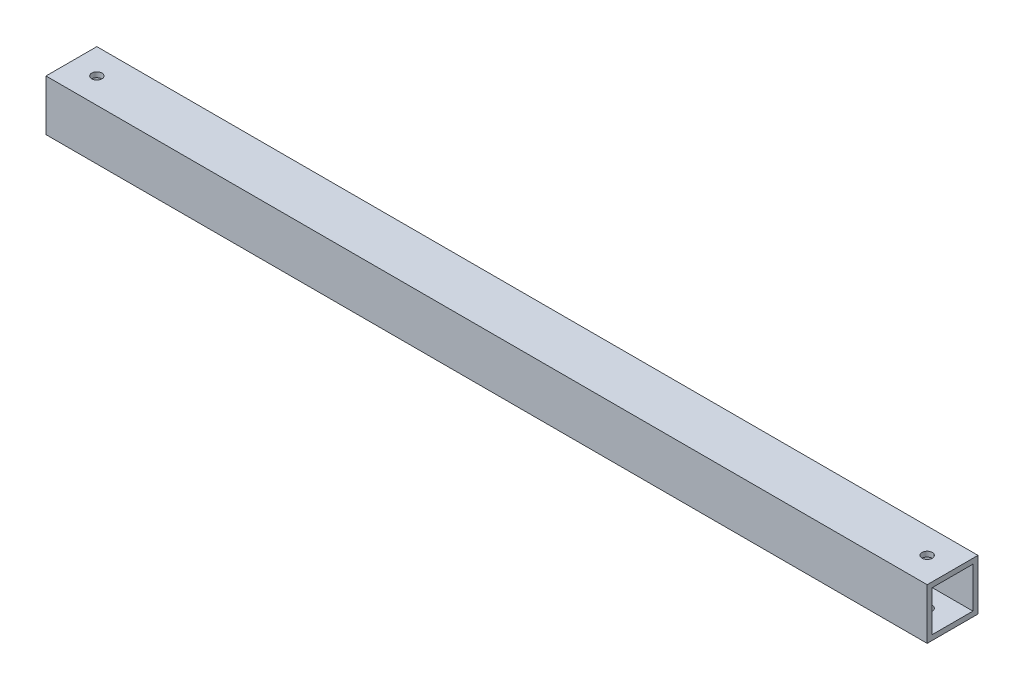
ISO-10303-21;
HEADER;
FILE_DESCRIPTION(('STEP AP214'),'2;1');
FILE_NAME('part.step','',(''),(''),'','','');
FILE_SCHEMA(('AUTOMOTIVE_DESIGN { 1 0 10303 214 1 1 1 1 }'));
ENDSEC;
DATA;
#1=APPLICATION_CONTEXT('core data for automotive mechanical design processes');
#2=APPLICATION_PROTOCOL_DEFINITION('international standard','automotive_design',2000,#1);
#3=PRODUCT_CONTEXT('',#1,'mechanical');
#4=PRODUCT('Part','Part','',(#3));
#5=PRODUCT_RELATED_PRODUCT_CATEGORY('part','',(#4));
#6=PRODUCT_DEFINITION_FORMATION('','',#4);
#7=PRODUCT_DEFINITION_CONTEXT('part definition',#1,'design');
#8=PRODUCT_DEFINITION('design','',#6,#7);
#9=PRODUCT_DEFINITION_SHAPE('','',#8);
#10=(LENGTH_UNIT() NAMED_UNIT(*) SI_UNIT(.MILLI.,.METRE.));
#11=(NAMED_UNIT(*) PLANE_ANGLE_UNIT() SI_UNIT($,.RADIAN.));
#12=(NAMED_UNIT(*) SI_UNIT($,.STERADIAN.) SOLID_ANGLE_UNIT());
#13=UNCERTAINTY_MEASURE_WITH_UNIT(LENGTH_MEASURE(1.E-05),#10,'distance_accuracy_value','');
#14=(GEOMETRIC_REPRESENTATION_CONTEXT(3) GLOBAL_UNCERTAINTY_ASSIGNED_CONTEXT((#13)) GLOBAL_UNIT_ASSIGNED_CONTEXT((#10,
#11,#12)) REPRESENTATION_CONTEXT('',''));
#15=CARTESIAN_POINT('',(0.,0.,0.));
#16=DIRECTION('',(0.,0.,1.));
#17=DIRECTION('',(1.,0.,0.));
#18=AXIS2_PLACEMENT_3D('',#15,#16,#17);
#19=CARTESIAN_POINT('',(252.5,0.,7.5));
#20=DIRECTION('',(0.,1.,0.));
#21=DIRECTION('',(0.,0.,1.));
#22=AXIS2_PLACEMENT_3D('',#19,#20,#21);
#23=CYLINDRICAL_SURFACE('',#22,1.50000000000002);
#24=CARTESIAN_POINT('',(252.5,1.5,7.5));
#25=DIRECTION('',(0.,-1.,0.));
#26=DIRECTION('',(0.,0.,-1.));
#27=AXIS2_PLACEMENT_3D('',#24,#25,#26);
#28=CIRCLE('',#27,1.50000000000002);
#29=CARTESIAN_POINT('',(252.5,1.5,5.99999999999998));
#30=VERTEX_POINT('',#29);
#31=EDGE_CURVE('E166',#30,#30,#28,.F.);
#32=ORIENTED_EDGE('',*,*,#31,.T.);
#33=EDGE_LOOP('',(#32));
#34=FACE_BOUND('',#33,.T.);
#35=CARTESIAN_POINT('',(252.5,0.,7.5));
#36=DIRECTION('',(0.,1.,0.));
#37=DIRECTION('',(0.,0.,1.));
#38=AXIS2_PLACEMENT_3D('',#35,#36,#37);
#39=CIRCLE('',#38,1.50000000000002);
#40=CARTESIAN_POINT('',(252.5,0.,9.00000000000002));
#41=VERTEX_POINT('',#40);
#42=EDGE_CURVE('E170',#41,#41,#39,.T.);
#43=ORIENTED_EDGE('',*,*,#42,.F.);
#44=EDGE_LOOP('',(#43));
#45=FACE_BOUND('',#44,.T.);
#46=ADVANCED_FACE('F45',(#34,#45),#23,.F.);
#47=CARTESIAN_POINT('',(7.5,0.,7.50000000000003));
#48=DIRECTION('',(0.,1.,0.));
#49=DIRECTION('',(0.,0.,1.));
#50=AXIS2_PLACEMENT_3D('',#47,#48,#49);
#51=CYLINDRICAL_SURFACE('',#50,1.5);
#52=CARTESIAN_POINT('',(7.5,1.5,7.50000000000003));
#53=DIRECTION('',(0.,-1.,0.));
#54=DIRECTION('',(0.,0.,-1.));
#55=AXIS2_PLACEMENT_3D('',#52,#53,#54);
#56=CIRCLE('',#55,1.5);
#57=CARTESIAN_POINT('',(7.5,1.5,6.00000000000003));
#58=VERTEX_POINT('',#57);
#59=EDGE_CURVE('E49',#58,#58,#56,.F.);
#60=ORIENTED_EDGE('',*,*,#59,.T.);
#61=EDGE_LOOP('',(#60));
#62=FACE_BOUND('',#61,.T.);
#63=CARTESIAN_POINT('',(7.5,0.,7.50000000000003));
#64=DIRECTION('',(0.,1.,0.));
#65=DIRECTION('',(0.,0.,1.));
#66=AXIS2_PLACEMENT_3D('',#63,#64,#65);
#67=CIRCLE('',#66,1.5);
#68=CARTESIAN_POINT('',(7.5,0.,9.00000000000003));
#69=VERTEX_POINT('',#68);
#70=EDGE_CURVE('E171',#69,#69,#67,.T.);
#71=ORIENTED_EDGE('',*,*,#70,.F.);
#72=EDGE_LOOP('',(#71));
#73=FACE_BOUND('',#72,.T.);
#74=ADVANCED_FACE('F276',(#62,#73),#51,.F.);
#75=CARTESIAN_POINT('',(0.,0.,15.));
#76=DIRECTION('',(1.,0.,0.));
#77=DIRECTION('',(0.,0.,-1.));
#78=AXIS2_PLACEMENT_3D('',#75,#76,#77);
#79=PLANE('',#78);
#80=DIRECTION('',(0.,-1.,0.));
#81=VECTOR('',#80,1.);
#82=CARTESIAN_POINT('',(0.,13.5,13.5));
#83=LINE('',#82,#81);
#84=CARTESIAN_POINT('',(0.,13.5,13.5));
#85=VERTEX_POINT('',#84);
#86=CARTESIAN_POINT('',(0.,1.5,13.5));
#87=VERTEX_POINT('',#86);
#88=EDGE_CURVE('E123',#85,#87,#83,.T.);
#89=ORIENTED_EDGE('',*,*,#88,.T.);
#90=DIRECTION('',(0.,0.,-1.));
#91=VECTOR('',#90,1.);
#92=CARTESIAN_POINT('',(0.,1.5,13.5));
#93=LINE('',#92,#91);
#94=CARTESIAN_POINT('',(0.,1.5,1.5));
#95=VERTEX_POINT('',#94);
#96=EDGE_CURVE('E116',#87,#95,#93,.T.);
#97=ORIENTED_EDGE('',*,*,#96,.T.);
#98=DIRECTION('',(0.,1.,0.));
#99=VECTOR('',#98,1.);
#100=CARTESIAN_POINT('',(0.,1.5,1.5));
#101=LINE('',#100,#99);
#102=CARTESIAN_POINT('',(0.,13.5,1.5));
#103=VERTEX_POINT('',#102);
#104=EDGE_CURVE('E126',#95,#103,#101,.T.);
#105=ORIENTED_EDGE('',*,*,#104,.T.);
#106=DIRECTION('',(0.,0.,1.));
#107=VECTOR('',#106,1.);
#108=CARTESIAN_POINT('',(0.,13.5,1.5));
#109=LINE('',#108,#107);
#110=EDGE_CURVE('E63',#103,#85,#109,.T.);
#111=ORIENTED_EDGE('',*,*,#110,.T.);
#112=EDGE_LOOP('',(#89,#97,#105,#111));
#113=FACE_BOUND('',#112,.T.);
#114=DIRECTION('',(0.,-1.,0.));
#115=VECTOR('',#114,1.);
#116=CARTESIAN_POINT('',(0.,0.,0.));
#117=LINE('',#116,#115);
#118=CARTESIAN_POINT('',(0.,15.,0.));
#119=VERTEX_POINT('',#118);
#120=CARTESIAN_POINT('',(0.,0.,0.));
#121=VERTEX_POINT('',#120);
#122=EDGE_CURVE('E175',#119,#121,#117,.T.);
#123=ORIENTED_EDGE('',*,*,#122,.T.);
#124=DIRECTION('',(0.,0.,-1.));
#125=VECTOR('',#124,1.);
#126=CARTESIAN_POINT('',(0.,0.,15.));
#127=LINE('',#126,#125);
#128=CARTESIAN_POINT('',(0.,0.,15.));
#129=VERTEX_POINT('',#128);
#130=EDGE_CURVE('E11',#129,#121,#127,.T.);
#131=ORIENTED_EDGE('',*,*,#130,.F.);
#132=DIRECTION('',(0.,-1.,0.));
#133=VECTOR('',#132,1.);
#134=CARTESIAN_POINT('',(0.,0.,15.));
#135=LINE('',#134,#133);
#136=CARTESIAN_POINT('',(0.,15.,15.));
#137=VERTEX_POINT('',#136);
#138=EDGE_CURVE('E187',#137,#129,#135,.T.);
#139=ORIENTED_EDGE('',*,*,#138,.F.);
#140=DIRECTION('',(0.,0.,-1.));
#141=VECTOR('',#140,1.);
#142=CARTESIAN_POINT('',(0.,15.,15.));
#143=LINE('',#142,#141);
#144=EDGE_CURVE('E201',#137,#119,#143,.T.);
#145=ORIENTED_EDGE('',*,*,#144,.T.);
#146=EDGE_LOOP('',(#123,#131,#139,#145));
#147=FACE_BOUND('',#146,.T.);
#148=ADVANCED_FACE('F47',(#113,#147),#79,.F.);
#149=CARTESIAN_POINT('',(0.,0.,15.));
#150=DIRECTION('',(0.,1.,0.));
#151=DIRECTION('',(0.,0.,1.));
#152=AXIS2_PLACEMENT_3D('',#149,#150,#151);
#153=PLANE('',#152);
#154=ORIENTED_EDGE('',*,*,#70,.T.);
#155=EDGE_LOOP('',(#154));
#156=FACE_BOUND('',#155,.T.);
#157=ORIENTED_EDGE('',*,*,#42,.T.);
#158=EDGE_LOOP('',(#157));
#159=FACE_BOUND('',#158,.T.);
#160=DIRECTION('',(1.,0.,0.));
#161=VECTOR('',#160,1.);
#162=CARTESIAN_POINT('',(0.,0.,0.));
#163=LINE('',#162,#161);
#164=CARTESIAN_POINT('',(260.,0.,0.));
#165=VERTEX_POINT('',#164);
#166=EDGE_CURVE('E205',#121,#165,#163,.T.);
#167=ORIENTED_EDGE('',*,*,#166,.T.);
#168=DIRECTION('',(0.,0.,-1.));
#169=VECTOR('',#168,1.);
#170=CARTESIAN_POINT('',(260.,0.,15.));
#171=LINE('',#170,#169);
#172=CARTESIAN_POINT('',(260.,0.,15.));
#173=VERTEX_POINT('',#172);
#174=EDGE_CURVE('E55',#173,#165,#171,.T.);
#175=ORIENTED_EDGE('',*,*,#174,.F.);
#176=DIRECTION('',(1.,0.,0.));
#177=VECTOR('',#176,1.);
#178=CARTESIAN_POINT('',(0.,0.,15.));
#179=LINE('',#178,#177);
#180=EDGE_CURVE('E191',#129,#173,#179,.T.);
#181=ORIENTED_EDGE('',*,*,#180,.F.);
#182=ORIENTED_EDGE('',*,*,#130,.T.);
#183=EDGE_LOOP('',(#167,#175,#181,#182));
#184=FACE_BOUND('',#183,.T.);
#185=ADVANCED_FACE('F263',(#156,#159,#184),#153,.F.);
#186=CARTESIAN_POINT('',(260.,0.,15.));
#187=DIRECTION('',(-1.,0.,0.));
#188=DIRECTION('',(0.,0.,1.));
#189=AXIS2_PLACEMENT_3D('',#186,#187,#188);
#190=PLANE('',#189);
#191=DIRECTION('',(0.,1.,0.));
#192=VECTOR('',#191,1.);
#193=CARTESIAN_POINT('',(260.,1.5,1.5));
#194=LINE('',#193,#192);
#195=CARTESIAN_POINT('',(260.,1.5,1.5));
#196=VERTEX_POINT('',#195);
#197=CARTESIAN_POINT('',(260.,13.5,1.5));
#198=VERTEX_POINT('',#197);
#199=EDGE_CURVE('E147',#196,#198,#194,.T.);
#200=ORIENTED_EDGE('',*,*,#199,.F.);
#201=DIRECTION('',(0.,0.,-1.));
#202=VECTOR('',#201,1.);
#203=CARTESIAN_POINT('',(260.,1.5,13.5));
#204=LINE('',#203,#202);
#205=CARTESIAN_POINT('',(260.,1.5,13.5));
#206=VERTEX_POINT('',#205);
#207=EDGE_CURVE('E71',#206,#196,#204,.T.);
#208=ORIENTED_EDGE('',*,*,#207,.F.);
#209=DIRECTION('',(0.,-1.,0.));
#210=VECTOR('',#209,1.);
#211=CARTESIAN_POINT('',(260.,13.5,13.5));
#212=LINE('',#211,#210);
#213=CARTESIAN_POINT('',(260.,13.5,13.5));
#214=VERTEX_POINT('',#213);
#215=EDGE_CURVE('E134',#214,#206,#212,.T.);
#216=ORIENTED_EDGE('',*,*,#215,.F.);
#217=DIRECTION('',(0.,0.,1.));
#218=VECTOR('',#217,1.);
#219=CARTESIAN_POINT('',(260.,13.5,1.5));
#220=LINE('',#219,#218);
#221=EDGE_CURVE('E138',#198,#214,#220,.T.);
#222=ORIENTED_EDGE('',*,*,#221,.F.);
#223=EDGE_LOOP('',(#200,#208,#216,#222));
#224=FACE_BOUND('',#223,.T.);
#225=DIRECTION('',(0.,1.,0.));
#226=VECTOR('',#225,1.);
#227=CARTESIAN_POINT('',(260.,0.,0.));
#228=LINE('',#227,#226);
#229=CARTESIAN_POINT('',(260.,15.,0.));
#230=VERTEX_POINT('',#229);
#231=EDGE_CURVE('E208',#165,#230,#228,.T.);
#232=ORIENTED_EDGE('',*,*,#231,.T.);
#233=DIRECTION('',(0.,0.,-1.));
#234=VECTOR('',#233,1.);
#235=CARTESIAN_POINT('',(260.,15.,15.));
#236=LINE('',#235,#234);
#237=CARTESIAN_POINT('',(260.,15.,15.));
#238=VERTEX_POINT('',#237);
#239=EDGE_CURVE('E216',#238,#230,#236,.T.);
#240=ORIENTED_EDGE('',*,*,#239,.F.);
#241=DIRECTION('',(0.,1.,0.));
#242=VECTOR('',#241,1.);
#243=CARTESIAN_POINT('',(260.,0.,15.));
#244=LINE('',#243,#242);
#245=EDGE_CURVE('E195',#173,#238,#244,.T.);
#246=ORIENTED_EDGE('',*,*,#245,.F.);
#247=ORIENTED_EDGE('',*,*,#174,.T.);
#248=EDGE_LOOP('',(#232,#240,#246,#247));
#249=FACE_BOUND('',#248,.T.);
#250=ADVANCED_FACE('F249',(#224,#249),#190,.F.);
#251=CARTESIAN_POINT('',(0.,15.,15.));
#252=DIRECTION('',(0.,-1.,0.));
#253=DIRECTION('',(0.,0.,-1.));
#254=AXIS2_PLACEMENT_3D('',#251,#252,#253);
#255=PLANE('',#254);
#256=CARTESIAN_POINT('',(7.5,15.,7.50000000000003));
#257=DIRECTION('',(0.,1.,0.));
#258=DIRECTION('',(0.,0.,1.));
#259=AXIS2_PLACEMENT_3D('',#256,#257,#258);
#260=CIRCLE('',#259,1.5);
#261=CARTESIAN_POINT('',(7.5,15.,9.00000000000003));
#262=VERTEX_POINT('',#261);
#263=EDGE_CURVE('E176',#262,#262,#260,.T.);
#264=ORIENTED_EDGE('',*,*,#263,.F.);
#265=EDGE_LOOP('',(#264));
#266=FACE_BOUND('',#265,.T.);
#267=CARTESIAN_POINT('',(252.5,15.,7.5));
#268=DIRECTION('',(0.,1.,0.));
#269=DIRECTION('',(0.,0.,1.));
#270=AXIS2_PLACEMENT_3D('',#267,#268,#269);
#271=CIRCLE('',#270,1.50000000000002);
#272=CARTESIAN_POINT('',(252.5,15.,9.00000000000002));
#273=VERTEX_POINT('',#272);
#274=EDGE_CURVE('E180',#273,#273,#271,.T.);
#275=ORIENTED_EDGE('',*,*,#274,.F.);
#276=EDGE_LOOP('',(#275));
#277=FACE_BOUND('',#276,.T.);
#278=DIRECTION('',(-1.,0.,0.));
#279=VECTOR('',#278,1.);
#280=CARTESIAN_POINT('',(0.,15.,0.));
#281=LINE('',#280,#279);
#282=EDGE_CURVE('E192',#230,#119,#281,.T.);
#283=ORIENTED_EDGE('',*,*,#282,.T.);
#284=ORIENTED_EDGE('',*,*,#144,.F.);
#285=DIRECTION('',(-1.,0.,0.));
#286=VECTOR('',#285,1.);
#287=CARTESIAN_POINT('',(0.,15.,15.));
#288=LINE('',#287,#286);
#289=EDGE_CURVE('E198',#238,#137,#288,.T.);
#290=ORIENTED_EDGE('',*,*,#289,.F.);
#291=ORIENTED_EDGE('',*,*,#239,.T.);
#292=EDGE_LOOP('',(#283,#284,#290,#291));
#293=FACE_BOUND('',#292,.T.);
#294=ADVANCED_FACE('F245',(#266,#277,#293),#255,.F.);
#295=CARTESIAN_POINT('',(0.,0.,15.));
#296=DIRECTION('',(0.,0.,-1.));
#297=DIRECTION('',(-1.,0.,0.));
#298=AXIS2_PLACEMENT_3D('',#295,#296,#297);
#299=PLANE('',#298);
#300=ORIENTED_EDGE('',*,*,#138,.T.);
#301=ORIENTED_EDGE('',*,*,#180,.T.);
#302=ORIENTED_EDGE('',*,*,#245,.T.);
#303=ORIENTED_EDGE('',*,*,#289,.T.);
#304=EDGE_LOOP('',(#300,#301,#302,#303));
#305=FACE_BOUND('',#304,.T.);
#306=ADVANCED_FACE('F248',(#305),#299,.F.);
#307=CARTESIAN_POINT('',(0.,0.,0.));
#308=DIRECTION('',(0.,0.,-1.));
#309=DIRECTION('',(-1.,0.,0.));
#310=AXIS2_PLACEMENT_3D('',#307,#308,#309);
#311=PLANE('',#310);
#312=ORIENTED_EDGE('',*,*,#122,.F.);
#313=ORIENTED_EDGE('',*,*,#282,.F.);
#314=ORIENTED_EDGE('',*,*,#231,.F.);
#315=ORIENTED_EDGE('',*,*,#166,.F.);
#316=EDGE_LOOP('',(#312,#313,#314,#315));
#317=FACE_BOUND('',#316,.T.);
#318=ADVANCED_FACE('F241',(#317),#311,.T.);
#319=CARTESIAN_POINT('',(252.5,13.5,7.5));
#320=DIRECTION('',(0.,1.,0.));
#321=DIRECTION('',(0.,0.,1.));
#322=AXIS2_PLACEMENT_3D('',#319,#320,#321);
#323=CIRCLE('',#322,1.50000000000002);
#324=CARTESIAN_POINT('',(252.5,13.5,9.00000000000002));
#325=VERTEX_POINT('',#324);
#326=EDGE_CURVE('E162',#325,#325,#323,.F.);
#327=ORIENTED_EDGE('',*,*,#326,.T.);
#328=EDGE_LOOP('',(#327));
#329=FACE_BOUND('',#328,.T.);
#330=ORIENTED_EDGE('',*,*,#274,.T.);
#331=EDGE_LOOP('',(#330));
#332=FACE_BOUND('',#331,.T.);
#333=ADVANCED_FACE('F238',(#329,#332),#23,.F.);
#334=CARTESIAN_POINT('',(7.5,13.5,7.50000000000003));
#335=DIRECTION('',(0.,1.,0.));
#336=DIRECTION('',(0.,0.,1.));
#337=AXIS2_PLACEMENT_3D('',#334,#335,#336);
#338=CIRCLE('',#337,1.5);
#339=CARTESIAN_POINT('',(7.5,13.5,9.00000000000003));
#340=VERTEX_POINT('',#339);
#341=EDGE_CURVE('E156',#340,#340,#338,.F.);
#342=ORIENTED_EDGE('',*,*,#341,.T.);
#343=EDGE_LOOP('',(#342));
#344=FACE_BOUND('',#343,.T.);
#345=ORIENTED_EDGE('',*,*,#263,.T.);
#346=EDGE_LOOP('',(#345));
#347=FACE_BOUND('',#346,.T.);
#348=ADVANCED_FACE('F226',(#344,#347),#51,.F.);
#349=CARTESIAN_POINT('',(0.,1.5,13.5));
#350=DIRECTION('',(0.,-1.,0.));
#351=DIRECTION('',(0.,0.,-1.));
#352=AXIS2_PLACEMENT_3D('',#349,#350,#351);
#353=PLANE('',#352);
#354=ORIENTED_EDGE('',*,*,#59,.F.);
#355=EDGE_LOOP('',(#354));
#356=FACE_BOUND('',#355,.T.);
#357=ORIENTED_EDGE('',*,*,#207,.T.);
#358=DIRECTION('',(1.,0.,0.));
#359=VECTOR('',#358,1.);
#360=CARTESIAN_POINT('',(0.,1.5,1.5));
#361=LINE('',#360,#359);
#362=EDGE_CURVE('E111',#95,#196,#361,.T.);
#363=ORIENTED_EDGE('',*,*,#362,.F.);
#364=ORIENTED_EDGE('',*,*,#96,.F.);
#365=DIRECTION('',(1.,0.,0.));
#366=VECTOR('',#365,1.);
#367=CARTESIAN_POINT('',(0.,1.5,13.5));
#368=LINE('',#367,#366);
#369=EDGE_CURVE('E153',#87,#206,#368,.T.);
#370=ORIENTED_EDGE('',*,*,#369,.T.);
#371=EDGE_LOOP('',(#357,#363,#364,#370));
#372=FACE_BOUND('',#371,.T.);
#373=ORIENTED_EDGE('',*,*,#31,.F.);
#374=EDGE_LOOP('',(#373));
#375=FACE_BOUND('',#374,.T.);
#376=ADVANCED_FACE('F113',(#356,#372,#375),#353,.F.);
#377=CARTESIAN_POINT('',(0.,13.5,1.5));
#378=DIRECTION('',(0.,1.,0.));
#379=DIRECTION('',(0.,0.,1.));
#380=AXIS2_PLACEMENT_3D('',#377,#378,#379);
#381=PLANE('',#380);
#382=ORIENTED_EDGE('',*,*,#341,.F.);
#383=EDGE_LOOP('',(#382));
#384=FACE_BOUND('',#383,.T.);
#385=ORIENTED_EDGE('',*,*,#221,.T.);
#386=DIRECTION('',(1.,0.,0.));
#387=VECTOR('',#386,1.);
#388=CARTESIAN_POINT('',(0.,13.5,13.5));
#389=LINE('',#388,#387);
#390=EDGE_CURVE('E157',#85,#214,#389,.T.);
#391=ORIENTED_EDGE('',*,*,#390,.F.);
#392=ORIENTED_EDGE('',*,*,#110,.F.);
#393=DIRECTION('',(1.,0.,0.));
#394=VECTOR('',#393,1.);
#395=CARTESIAN_POINT('',(0.,13.5,1.5));
#396=LINE('',#395,#394);
#397=EDGE_CURVE('E122',#103,#198,#396,.T.);
#398=ORIENTED_EDGE('',*,*,#397,.T.);
#399=EDGE_LOOP('',(#385,#391,#392,#398));
#400=FACE_BOUND('',#399,.T.);
#401=ORIENTED_EDGE('',*,*,#326,.F.);
#402=EDGE_LOOP('',(#401));
#403=FACE_BOUND('',#402,.T.);
#404=ADVANCED_FACE('F229',(#384,#400,#403),#381,.F.);
#405=CARTESIAN_POINT('',(0.,13.5,13.5));
#406=DIRECTION('',(0.,0.,1.));
#407=DIRECTION('',(1.,0.,0.));
#408=AXIS2_PLACEMENT_3D('',#405,#406,#407);
#409=PLANE('',#408);
#410=ORIENTED_EDGE('',*,*,#215,.T.);
#411=ORIENTED_EDGE('',*,*,#369,.F.);
#412=ORIENTED_EDGE('',*,*,#88,.F.);
#413=ORIENTED_EDGE('',*,*,#390,.T.);
#414=EDGE_LOOP('',(#410,#411,#412,#413));
#415=FACE_BOUND('',#414,.T.);
#416=ADVANCED_FACE('F231',(#415),#409,.F.);
#417=CARTESIAN_POINT('',(0.,1.5,1.5));
#418=DIRECTION('',(0.,0.,-1.));
#419=DIRECTION('',(-1.,0.,0.));
#420=AXIS2_PLACEMENT_3D('',#417,#418,#419);
#421=PLANE('',#420);
#422=ORIENTED_EDGE('',*,*,#199,.T.);
#423=ORIENTED_EDGE('',*,*,#397,.F.);
#424=ORIENTED_EDGE('',*,*,#104,.F.);
#425=ORIENTED_EDGE('',*,*,#362,.T.);
#426=EDGE_LOOP('',(#422,#423,#424,#425));
#427=FACE_BOUND('',#426,.T.);
#428=ADVANCED_FACE('F127',(#427),#421,.F.);
#429=CLOSED_SHELL('',(#46,#74,#148,#185,#250,#294,#306,#318,#333,#348,#376,#404,#416,#428));
#430=MANIFOLD_SOLID_BREP('B2',#429);
#431=ADVANCED_BREP_SHAPE_REPRESENTATION('',(#18,#430),#14);
#432=SHAPE_DEFINITION_REPRESENTATION(#9,#431);
ENDSEC;
END-ISO-10303-21;
